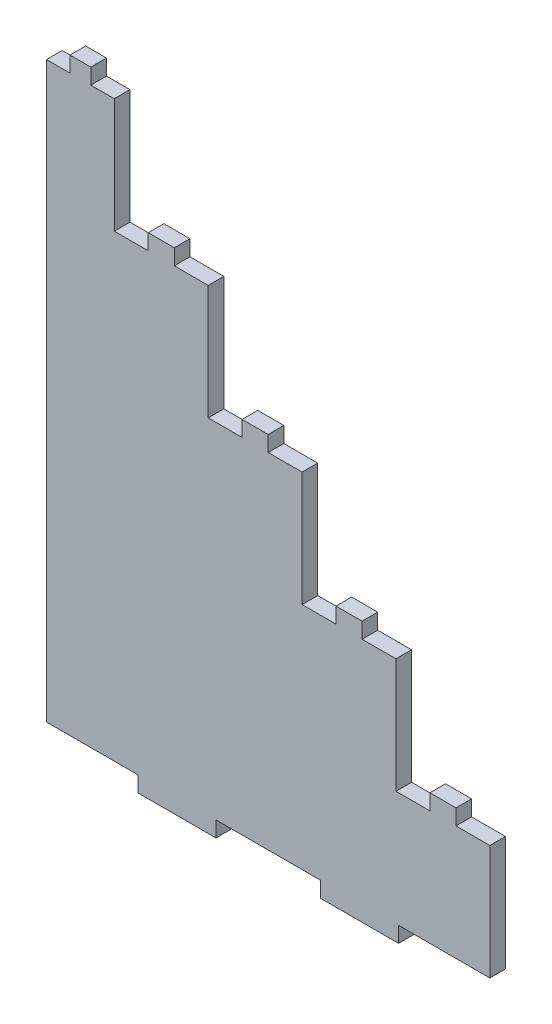
ISO-10303-21;
HEADER;
FILE_DESCRIPTION(('STEP AP214'),'2;1');
FILE_NAME('part.step','',(''),(''),'','','');
FILE_SCHEMA(('AUTOMOTIVE_DESIGN { 1 0 10303 214 1 1 1 1 }'));
ENDSEC;
DATA;
#1=APPLICATION_CONTEXT('core data for automotive mechanical design processes');
#2=APPLICATION_PROTOCOL_DEFINITION('international standard','automotive_design',2000,#1);
#3=PRODUCT_CONTEXT('',#1,'mechanical');
#4=PRODUCT('Part','Part','',(#3));
#5=PRODUCT_RELATED_PRODUCT_CATEGORY('part','',(#4));
#6=PRODUCT_DEFINITION_FORMATION('','',#4);
#7=PRODUCT_DEFINITION_CONTEXT('part definition',#1,'design');
#8=PRODUCT_DEFINITION('design','',#6,#7);
#9=PRODUCT_DEFINITION_SHAPE('','',#8);
#10=(LENGTH_UNIT() NAMED_UNIT(*) SI_UNIT(.MILLI.,.METRE.));
#11=(NAMED_UNIT(*) PLANE_ANGLE_UNIT() SI_UNIT($,.RADIAN.));
#12=(NAMED_UNIT(*) SI_UNIT($,.STERADIAN.) SOLID_ANGLE_UNIT());
#13=UNCERTAINTY_MEASURE_WITH_UNIT(LENGTH_MEASURE(1.E-05),#10,'distance_accuracy_value','');
#14=(GEOMETRIC_REPRESENTATION_CONTEXT(3) GLOBAL_UNCERTAINTY_ASSIGNED_CONTEXT((#13)) GLOBAL_UNIT_ASSIGNED_CONTEXT((#10,
#11,#12)) REPRESENTATION_CONTEXT('',''));
#15=CARTESIAN_POINT('',(0.,0.,0.));
#16=DIRECTION('',(0.,0.,1.));
#17=DIRECTION('',(1.,0.,0.));
#18=AXIS2_PLACEMENT_3D('',#15,#16,#17);
#19=CARTESIAN_POINT('',(134.,44.,6.));
#20=DIRECTION('',(0.,-1.,0.));
#21=DIRECTION('',(0.,0.,-1.));
#22=AXIS2_PLACEMENT_3D('',#19,#20,#21);
#23=PLANE('',#22);
#24=DIRECTION('',(0.,0.,1.));
#25=VECTOR('',#24,1.);
#26=CARTESIAN_POINT('',(147.,44.,6.));
#27=LINE('',#26,#25);
#28=CARTESIAN_POINT('',(147.,44.,0.));
#29=VERTEX_POINT('',#28);
#30=CARTESIAN_POINT('',(147.,44.,6.));
#31=VERTEX_POINT('',#30);
#32=EDGE_CURVE('E316',#29,#31,#27,.T.);
#33=ORIENTED_EDGE('',*,*,#32,.F.);
#34=DIRECTION('',(-1.,0.,0.));
#35=VECTOR('',#34,1.);
#36=CARTESIAN_POINT('',(134.,44.,0.));
#37=LINE('',#36,#35);
#38=CARTESIAN_POINT('',(134.,44.,0.));
#39=VERTEX_POINT('',#38);
#40=EDGE_CURVE('E588',#29,#39,#37,.T.);
#41=ORIENTED_EDGE('',*,*,#40,.T.);
#42=DIRECTION('',(0.,0.,-1.));
#43=VECTOR('',#42,1.);
#44=CARTESIAN_POINT('',(134.,44.,6.));
#45=LINE('',#44,#43);
#46=CARTESIAN_POINT('',(134.,44.,6.));
#47=VERTEX_POINT('',#46);
#48=EDGE_CURVE('E525',#47,#39,#45,.T.);
#49=ORIENTED_EDGE('',*,*,#48,.F.);
#50=DIRECTION('',(-1.,0.,0.));
#51=VECTOR('',#50,1.);
#52=CARTESIAN_POINT('',(134.,44.,6.));
#53=LINE('',#52,#51);
#54=EDGE_CURVE('E50',#31,#47,#53,.T.);
#55=ORIENTED_EDGE('',*,*,#54,.F.);
#56=EDGE_LOOP('',(#33,#41,#49,#55));
#57=FACE_BOUND('',#56,.T.);
#58=ADVANCED_FACE('F33',(#57),#23,.F.);
#59=DIRECTION('',(0.,0.,-1.));
#60=VECTOR('',#59,1.);
#61=CARTESIAN_POINT('',(157.,44.,6.));
#62=LINE('',#61,#60);
#63=CARTESIAN_POINT('',(157.,44.,6.));
#64=VERTEX_POINT('',#63);
#65=CARTESIAN_POINT('',(157.,44.,0.));
#66=VERTEX_POINT('',#65);
#67=EDGE_CURVE('E58',#64,#66,#62,.T.);
#68=ORIENTED_EDGE('',*,*,#67,.F.);
#69=CARTESIAN_POINT('',(170.,44.,6.));
#70=VERTEX_POINT('',#69);
#71=EDGE_CURVE('E597',#70,#64,#53,.T.);
#72=ORIENTED_EDGE('',*,*,#71,.F.);
#73=DIRECTION('',(0.,0.,-1.));
#74=VECTOR('',#73,1.);
#75=CARTESIAN_POINT('',(170.,44.,6.));
#76=LINE('',#75,#74);
#77=CARTESIAN_POINT('',(170.,44.,0.));
#78=VERTEX_POINT('',#77);
#79=EDGE_CURVE('E522',#70,#78,#76,.T.);
#80=ORIENTED_EDGE('',*,*,#79,.T.);
#81=EDGE_CURVE('E587',#78,#66,#37,.T.);
#82=ORIENTED_EDGE('',*,*,#81,.T.);
#83=EDGE_LOOP('',(#68,#72,#80,#82));
#84=FACE_BOUND('',#83,.T.);
#85=ADVANCED_FACE('F596',(#84),#23,.F.);
#86=CARTESIAN_POINT('',(98.,87.9999999999999,6.));
#87=DIRECTION('',(0.,-1.,0.));
#88=DIRECTION('',(1.,0.,0.));
#89=AXIS2_PLACEMENT_3D('',#86,#87,#88);
#90=PLANE('',#89);
#91=DIRECTION('',(0.,0.,1.));
#92=VECTOR('',#91,1.);
#93=CARTESIAN_POINT('',(111.,87.9999999999999,6.));
#94=LINE('',#93,#92);
#95=CARTESIAN_POINT('',(111.,87.9999999999999,0.));
#96=VERTEX_POINT('',#95);
#97=CARTESIAN_POINT('',(111.,87.9999999999999,6.));
#98=VERTEX_POINT('',#97);
#99=EDGE_CURVE('E317',#96,#98,#94,.T.);
#100=ORIENTED_EDGE('',*,*,#99,.F.);
#101=DIRECTION('',(-1.,0.,0.));
#102=VECTOR('',#101,1.);
#103=CARTESIAN_POINT('',(98.,87.9999999999999,0.));
#104=LINE('',#103,#102);
#105=CARTESIAN_POINT('',(98.,87.9999999999999,0.));
#106=VERTEX_POINT('',#105);
#107=EDGE_CURVE('E585',#96,#106,#104,.T.);
#108=ORIENTED_EDGE('',*,*,#107,.T.);
#109=DIRECTION('',(0.,0.,-1.));
#110=VECTOR('',#109,1.);
#111=CARTESIAN_POINT('',(98.,87.9999999999999,6.));
#112=LINE('',#111,#110);
#113=CARTESIAN_POINT('',(98.,87.9999999999999,6.));
#114=VERTEX_POINT('',#113);
#115=EDGE_CURVE('E531',#114,#106,#112,.T.);
#116=ORIENTED_EDGE('',*,*,#115,.F.);
#117=DIRECTION('',(-1.,0.,0.));
#118=VECTOR('',#117,1.);
#119=CARTESIAN_POINT('',(98.,87.9999999999999,6.));
#120=LINE('',#119,#118);
#121=EDGE_CURVE('E682',#98,#114,#120,.T.);
#122=ORIENTED_EDGE('',*,*,#121,.F.);
#123=EDGE_LOOP('',(#100,#108,#116,#122));
#124=FACE_BOUND('',#123,.T.);
#125=ADVANCED_FACE('F624',(#124),#90,.F.);
#126=DIRECTION('',(0.,0.,-1.));
#127=VECTOR('',#126,1.);
#128=CARTESIAN_POINT('',(121.,87.9999999999999,6.));
#129=LINE('',#128,#127);
#130=CARTESIAN_POINT('',(121.,87.9999999999999,6.));
#131=VERTEX_POINT('',#130);
#132=CARTESIAN_POINT('',(121.,87.9999999999999,0.));
#133=VERTEX_POINT('',#132);
#134=EDGE_CURVE('E320',#131,#133,#129,.T.);
#135=ORIENTED_EDGE('',*,*,#134,.F.);
#136=CARTESIAN_POINT('',(134.,87.9999999999999,6.));
#137=VERTEX_POINT('',#136);
#138=EDGE_CURVE('E683',#137,#131,#120,.T.);
#139=ORIENTED_EDGE('',*,*,#138,.F.);
#140=DIRECTION('',(0.,0.,-1.));
#141=VECTOR('',#140,1.);
#142=CARTESIAN_POINT('',(134.,87.9999999999999,6.));
#143=LINE('',#142,#141);
#144=CARTESIAN_POINT('',(134.,87.9999999999999,0.));
#145=VERTEX_POINT('',#144);
#146=EDGE_CURVE('E528',#137,#145,#143,.T.);
#147=ORIENTED_EDGE('',*,*,#146,.T.);
#148=EDGE_CURVE('E583',#145,#133,#104,.T.);
#149=ORIENTED_EDGE('',*,*,#148,.T.);
#150=EDGE_LOOP('',(#135,#139,#147,#149));
#151=FACE_BOUND('',#150,.T.);
#152=ADVANCED_FACE('F806',(#151),#90,.F.);
#153=CARTESIAN_POINT('',(62.,132.,6.));
#154=DIRECTION('',(0.,-1.,0.));
#155=DIRECTION('',(1.,0.,0.));
#156=AXIS2_PLACEMENT_3D('',#153,#154,#155);
#157=PLANE('',#156);
#158=DIRECTION('',(0.,0.,1.));
#159=VECTOR('',#158,1.);
#160=CARTESIAN_POINT('',(75.,132.,6.));
#161=LINE('',#160,#159);
#162=CARTESIAN_POINT('',(75.,132.,0.));
#163=VERTEX_POINT('',#162);
#164=CARTESIAN_POINT('',(75.,132.,6.));
#165=VERTEX_POINT('',#164);
#166=EDGE_CURVE('E349',#163,#165,#161,.T.);
#167=ORIENTED_EDGE('',*,*,#166,.F.);
#168=DIRECTION('',(-1.,0.,0.));
#169=VECTOR('',#168,1.);
#170=CARTESIAN_POINT('',(62.,132.,0.));
#171=LINE('',#170,#169);
#172=CARTESIAN_POINT('',(62.,132.,0.));
#173=VERTEX_POINT('',#172);
#174=EDGE_CURVE('E580',#163,#173,#171,.T.);
#175=ORIENTED_EDGE('',*,*,#174,.T.);
#176=DIRECTION('',(0.,0.,-1.));
#177=VECTOR('',#176,1.);
#178=CARTESIAN_POINT('',(62.,132.,6.));
#179=LINE('',#178,#177);
#180=CARTESIAN_POINT('',(62.,132.,6.));
#181=VERTEX_POINT('',#180);
#182=EDGE_CURVE('E537',#181,#173,#179,.T.);
#183=ORIENTED_EDGE('',*,*,#182,.F.);
#184=DIRECTION('',(-1.,0.,0.));
#185=VECTOR('',#184,1.);
#186=CARTESIAN_POINT('',(62.,132.,6.));
#187=LINE('',#186,#185);
#188=EDGE_CURVE('E688',#165,#181,#187,.T.);
#189=ORIENTED_EDGE('',*,*,#188,.F.);
#190=EDGE_LOOP('',(#167,#175,#183,#189));
#191=FACE_BOUND('',#190,.T.);
#192=ADVANCED_FACE('F767',(#191),#157,.F.);
#193=DIRECTION('',(0.,0.,-1.));
#194=VECTOR('',#193,1.);
#195=CARTESIAN_POINT('',(85.,132.,6.));
#196=LINE('',#195,#194);
#197=CARTESIAN_POINT('',(85.,132.,6.));
#198=VERTEX_POINT('',#197);
#199=CARTESIAN_POINT('',(85.,132.,0.));
#200=VERTEX_POINT('',#199);
#201=EDGE_CURVE('E354',#198,#200,#196,.T.);
#202=ORIENTED_EDGE('',*,*,#201,.F.);
#203=CARTESIAN_POINT('',(98.,132.,6.));
#204=VERTEX_POINT('',#203);
#205=EDGE_CURVE('E689',#204,#198,#187,.T.);
#206=ORIENTED_EDGE('',*,*,#205,.F.);
#207=DIRECTION('',(0.,0.,-1.));
#208=VECTOR('',#207,1.);
#209=CARTESIAN_POINT('',(98.,132.,6.));
#210=LINE('',#209,#208);
#211=CARTESIAN_POINT('',(98.,132.,0.));
#212=VERTEX_POINT('',#211);
#213=EDGE_CURVE('E534',#204,#212,#210,.T.);
#214=ORIENTED_EDGE('',*,*,#213,.T.);
#215=EDGE_CURVE('E578',#212,#200,#171,.T.);
#216=ORIENTED_EDGE('',*,*,#215,.T.);
#217=EDGE_LOOP('',(#202,#206,#214,#216));
#218=FACE_BOUND('',#217,.T.);
#219=ADVANCED_FACE('F782',(#218),#157,.F.);
#220=CARTESIAN_POINT('',(26.,176.,6.));
#221=DIRECTION('',(0.,-1.,0.));
#222=DIRECTION('',(0.,0.,-1.));
#223=AXIS2_PLACEMENT_3D('',#220,#221,#222);
#224=PLANE('',#223);
#225=DIRECTION('',(0.,0.,1.));
#226=VECTOR('',#225,1.);
#227=CARTESIAN_POINT('',(39.,176.,6.));
#228=LINE('',#227,#226);
#229=CARTESIAN_POINT('',(39.,176.,0.));
#230=VERTEX_POINT('',#229);
#231=CARTESIAN_POINT('',(39.,176.,6.));
#232=VERTEX_POINT('',#231);
#233=EDGE_CURVE('E376',#230,#232,#228,.T.);
#234=ORIENTED_EDGE('',*,*,#233,.F.);
#235=DIRECTION('',(-1.,0.,0.));
#236=VECTOR('',#235,1.);
#237=CARTESIAN_POINT('',(26.,176.,0.));
#238=LINE('',#237,#236);
#239=CARTESIAN_POINT('',(26.,176.,0.));
#240=VERTEX_POINT('',#239);
#241=EDGE_CURVE('E572',#230,#240,#238,.T.);
#242=ORIENTED_EDGE('',*,*,#241,.T.);
#243=DIRECTION('',(0.,0.,-1.));
#244=VECTOR('',#243,1.);
#245=CARTESIAN_POINT('',(26.,176.,6.));
#246=LINE('',#245,#244);
#247=CARTESIAN_POINT('',(26.,176.,6.));
#248=VERTEX_POINT('',#247);
#249=EDGE_CURVE('E543',#248,#240,#246,.T.);
#250=ORIENTED_EDGE('',*,*,#249,.F.);
#251=DIRECTION('',(-1.,0.,0.));
#252=VECTOR('',#251,1.);
#253=CARTESIAN_POINT('',(26.,176.,6.));
#254=LINE('',#253,#252);
#255=EDGE_CURVE('E694',#232,#248,#254,.T.);
#256=ORIENTED_EDGE('',*,*,#255,.F.);
#257=EDGE_LOOP('',(#234,#242,#250,#256));
#258=FACE_BOUND('',#257,.T.);
#259=ADVANCED_FACE('F743',(#258),#224,.F.);
#260=DIRECTION('',(0.,0.,-1.));
#261=VECTOR('',#260,1.);
#262=CARTESIAN_POINT('',(49.,176.,6.));
#263=LINE('',#262,#261);
#264=CARTESIAN_POINT('',(49.,176.,6.));
#265=VERTEX_POINT('',#264);
#266=CARTESIAN_POINT('',(49.,176.,0.));
#267=VERTEX_POINT('',#266);
#268=EDGE_CURVE('E381',#265,#267,#263,.T.);
#269=ORIENTED_EDGE('',*,*,#268,.F.);
#270=CARTESIAN_POINT('',(62.,176.,6.));
#271=VERTEX_POINT('',#270);
#272=EDGE_CURVE('E695',#271,#265,#254,.T.);
#273=ORIENTED_EDGE('',*,*,#272,.F.);
#274=DIRECTION('',(0.,0.,-1.));
#275=VECTOR('',#274,1.);
#276=CARTESIAN_POINT('',(62.,176.,6.));
#277=LINE('',#276,#275);
#278=CARTESIAN_POINT('',(62.,176.,0.));
#279=VERTEX_POINT('',#278);
#280=EDGE_CURVE('E540',#271,#279,#277,.T.);
#281=ORIENTED_EDGE('',*,*,#280,.T.);
#282=EDGE_CURVE('E568',#279,#267,#238,.T.);
#283=ORIENTED_EDGE('',*,*,#282,.T.);
#284=EDGE_LOOP('',(#269,#273,#281,#283));
#285=FACE_BOUND('',#284,.T.);
#286=ADVANCED_FACE('F756',(#285),#224,.F.);
#287=CARTESIAN_POINT('',(0.,220.,6.));
#288=DIRECTION('',(0.,-1.,0.));
#289=DIRECTION('',(0.,0.,-1.));
#290=AXIS2_PLACEMENT_3D('',#287,#288,#289);
#291=PLANE('',#290);
#292=DIRECTION('',(0.,0.,1.));
#293=VECTOR('',#292,1.);
#294=CARTESIAN_POINT('',(9.,220.,6.));
#295=LINE('',#294,#293);
#296=CARTESIAN_POINT('',(9.,220.,0.));
#297=VERTEX_POINT('',#296);
#298=CARTESIAN_POINT('',(9.,220.,6.));
#299=VERTEX_POINT('',#298);
#300=EDGE_CURVE('E403',#297,#299,#295,.T.);
#301=ORIENTED_EDGE('',*,*,#300,.F.);
#302=DIRECTION('',(-1.,0.,0.));
#303=VECTOR('',#302,1.);
#304=CARTESIAN_POINT('',(0.,220.,0.));
#305=LINE('',#304,#303);
#306=CARTESIAN_POINT('',(0.,220.,0.));
#307=VERTEX_POINT('',#306);
#308=EDGE_CURVE('E559',#297,#307,#305,.T.);
#309=ORIENTED_EDGE('',*,*,#308,.T.);
#310=DIRECTION('',(0.,0.,-1.));
#311=VECTOR('',#310,1.);
#312=CARTESIAN_POINT('',(0.,220.,6.));
#313=LINE('',#312,#311);
#314=CARTESIAN_POINT('',(0.,220.,6.));
#315=VERTEX_POINT('',#314);
#316=EDGE_CURVE('E549',#315,#307,#313,.T.);
#317=ORIENTED_EDGE('',*,*,#316,.F.);
#318=DIRECTION('',(-1.,0.,0.));
#319=VECTOR('',#318,1.);
#320=CARTESIAN_POINT('',(0.,220.,6.));
#321=LINE('',#320,#319);
#322=EDGE_CURVE('E699',#299,#315,#321,.T.);
#323=ORIENTED_EDGE('',*,*,#322,.F.);
#324=EDGE_LOOP('',(#301,#309,#317,#323));
#325=FACE_BOUND('',#324,.T.);
#326=ADVANCED_FACE('F647',(#325),#291,.F.);
#327=DIRECTION('',(0.,0.,-1.));
#328=VECTOR('',#327,1.);
#329=CARTESIAN_POINT('',(17.,220.,6.));
#330=LINE('',#329,#328);
#331=CARTESIAN_POINT('',(17.,220.,6.));
#332=VERTEX_POINT('',#331);
#333=CARTESIAN_POINT('',(17.,220.,0.));
#334=VERTEX_POINT('',#333);
#335=EDGE_CURVE('E408',#332,#334,#330,.T.);
#336=ORIENTED_EDGE('',*,*,#335,.F.);
#337=CARTESIAN_POINT('',(26.,220.,6.));
#338=VERTEX_POINT('',#337);
#339=EDGE_CURVE('E552',#338,#332,#321,.T.);
#340=ORIENTED_EDGE('',*,*,#339,.F.);
#341=DIRECTION('',(0.,0.,-1.));
#342=VECTOR('',#341,1.);
#343=CARTESIAN_POINT('',(26.,220.,6.));
#344=LINE('',#343,#342);
#345=CARTESIAN_POINT('',(26.,220.,0.));
#346=VERTEX_POINT('',#345);
#347=EDGE_CURVE('E546',#338,#346,#344,.T.);
#348=ORIENTED_EDGE('',*,*,#347,.T.);
#349=EDGE_CURVE('E561',#346,#334,#305,.T.);
#350=ORIENTED_EDGE('',*,*,#349,.T.);
#351=EDGE_LOOP('',(#336,#340,#348,#350));
#352=FACE_BOUND('',#351,.T.);
#353=ADVANCED_FACE('F642',(#352),#291,.F.);
#354=CARTESIAN_POINT('',(0.,0.,6.));
#355=DIRECTION('',(0.,1.,0.));
#356=DIRECTION('',(0.,0.,1.));
#357=AXIS2_PLACEMENT_3D('',#354,#355,#356);
#358=PLANE('',#357);
#359=DIRECTION('',(0.,0.,-1.));
#360=VECTOR('',#359,1.);
#361=CARTESIAN_POINT('',(105.,0.,0.));
#362=LINE('',#361,#360);
#363=CARTESIAN_POINT('',(105.,0.,6.));
#364=VERTEX_POINT('',#363);
#365=CARTESIAN_POINT('',(105.,0.,0.));
#366=VERTEX_POINT('',#365);
#367=EDGE_CURVE('E446',#364,#366,#362,.T.);
#368=ORIENTED_EDGE('',*,*,#367,.F.);
#369=DIRECTION('',(1.,0.,0.));
#370=VECTOR('',#369,1.);
#371=CARTESIAN_POINT('',(0.,0.,6.));
#372=LINE('',#371,#370);
#373=CARTESIAN_POINT('',(65.,0.,6.));
#374=VERTEX_POINT('',#373);
#375=EDGE_CURVE('E650',#374,#364,#372,.T.);
#376=ORIENTED_EDGE('',*,*,#375,.F.);
#377=DIRECTION('',(0.,0.,1.));
#378=VECTOR('',#377,1.);
#379=CARTESIAN_POINT('',(65.,0.,6.));
#380=LINE('',#379,#378);
#381=CARTESIAN_POINT('',(65.,0.,0.));
#382=VERTEX_POINT('',#381);
#383=EDGE_CURVE('E477',#382,#374,#380,.T.);
#384=ORIENTED_EDGE('',*,*,#383,.F.);
#385=DIRECTION('',(1.,0.,0.));
#386=VECTOR('',#385,1.);
#387=CARTESIAN_POINT('',(0.,0.,0.));
#388=LINE('',#387,#386);
#389=EDGE_CURVE('E502',#382,#366,#388,.T.);
#390=ORIENTED_EDGE('',*,*,#389,.T.);
#391=EDGE_LOOP('',(#368,#376,#384,#390));
#392=FACE_BOUND('',#391,.T.);
#393=ADVANCED_FACE('F634',(#392),#358,.F.);
#394=DIRECTION('',(0.,0.,1.));
#395=VECTOR('',#394,1.);
#396=CARTESIAN_POINT('',(135.,0.,0.));
#397=LINE('',#396,#395);
#398=CARTESIAN_POINT('',(135.,0.,0.));
#399=VERTEX_POINT('',#398);
#400=CARTESIAN_POINT('',(135.,0.,6.));
#401=VERTEX_POINT('',#400);
#402=EDGE_CURVE('E449',#399,#401,#397,.T.);
#403=ORIENTED_EDGE('',*,*,#402,.F.);
#404=CARTESIAN_POINT('',(170.,0.,0.));
#405=VERTEX_POINT('',#404);
#406=EDGE_CURVE('E499',#399,#405,#388,.T.);
#407=ORIENTED_EDGE('',*,*,#406,.T.);
#408=DIRECTION('',(0.,0.,-1.));
#409=VECTOR('',#408,1.);
#410=CARTESIAN_POINT('',(170.,0.,6.));
#411=LINE('',#410,#409);
#412=CARTESIAN_POINT('',(170.,0.,6.));
#413=VERTEX_POINT('',#412);
#414=EDGE_CURVE('E42',#413,#405,#411,.T.);
#415=ORIENTED_EDGE('',*,*,#414,.F.);
#416=EDGE_CURVE('E504',#401,#413,#372,.T.);
#417=ORIENTED_EDGE('',*,*,#416,.F.);
#418=EDGE_LOOP('',(#403,#407,#415,#417));
#419=FACE_BOUND('',#418,.T.);
#420=ADVANCED_FACE('F632',(#419),#358,.F.);
#421=DIRECTION('',(0.,0.,-1.));
#422=VECTOR('',#421,1.);
#423=CARTESIAN_POINT('',(35.,0.,6.));
#424=LINE('',#423,#422);
#425=CARTESIAN_POINT('',(35.,0.,6.));
#426=VERTEX_POINT('',#425);
#427=CARTESIAN_POINT('',(35.,0.,0.));
#428=VERTEX_POINT('',#427);
#429=EDGE_CURVE('E472',#426,#428,#424,.T.);
#430=ORIENTED_EDGE('',*,*,#429,.F.);
#431=CARTESIAN_POINT('',(0.,0.,6.));
#432=VERTEX_POINT('',#431);
#433=EDGE_CURVE('E659',#432,#426,#372,.T.);
#434=ORIENTED_EDGE('',*,*,#433,.F.);
#435=DIRECTION('',(0.,0.,-1.));
#436=VECTOR('',#435,1.);
#437=CARTESIAN_POINT('',(0.,0.,6.));
#438=LINE('',#437,#436);
#439=CARTESIAN_POINT('',(0.,0.,0.));
#440=VERTEX_POINT('',#439);
#441=EDGE_CURVE('E11',#432,#440,#438,.T.);
#442=ORIENTED_EDGE('',*,*,#441,.T.);
#443=EDGE_CURVE('E518',#440,#428,#388,.T.);
#444=ORIENTED_EDGE('',*,*,#443,.T.);
#445=EDGE_LOOP('',(#430,#434,#442,#444));
#446=FACE_BOUND('',#445,.T.);
#447=ADVANCED_FACE('F630',(#446),#358,.F.);
#448=CARTESIAN_POINT('',(0.,0.,6.));
#449=DIRECTION('',(1.,0.,0.));
#450=DIRECTION('',(0.,0.,-1.));
#451=AXIS2_PLACEMENT_3D('',#448,#449,#450);
#452=PLANE('',#451);
#453=DIRECTION('',(0.,-1.,0.));
#454=VECTOR('',#453,1.);
#455=CARTESIAN_POINT('',(0.,0.,0.));
#456=LINE('',#455,#454);
#457=EDGE_CURVE('E503',#307,#440,#456,.T.);
#458=ORIENTED_EDGE('',*,*,#457,.T.);
#459=ORIENTED_EDGE('',*,*,#441,.F.);
#460=DIRECTION('',(0.,-1.,0.));
#461=VECTOR('',#460,1.);
#462=CARTESIAN_POINT('',(0.,0.,6.));
#463=LINE('',#462,#461);
#464=EDGE_CURVE('E562',#315,#432,#463,.T.);
#465=ORIENTED_EDGE('',*,*,#464,.F.);
#466=ORIENTED_EDGE('',*,*,#316,.T.);
#467=EDGE_LOOP('',(#458,#459,#465,#466));
#468=FACE_BOUND('',#467,.T.);
#469=ADVANCED_FACE('F35',(#468),#452,.F.);
#470=CARTESIAN_POINT('',(170.,44.,6.));
#471=DIRECTION('',(-1.,0.,0.));
#472=DIRECTION('',(0.,0.,1.));
#473=AXIS2_PLACEMENT_3D('',#470,#471,#472);
#474=PLANE('',#473);
#475=DIRECTION('',(0.,1.,0.));
#476=VECTOR('',#475,1.);
#477=CARTESIAN_POINT('',(170.,44.,0.));
#478=LINE('',#477,#476);
#479=EDGE_CURVE('E511',#405,#78,#478,.T.);
#480=ORIENTED_EDGE('',*,*,#479,.T.);
#481=ORIENTED_EDGE('',*,*,#79,.F.);
#482=DIRECTION('',(0.,1.,0.));
#483=VECTOR('',#482,1.);
#484=CARTESIAN_POINT('',(170.,44.,6.));
#485=LINE('',#484,#483);
#486=EDGE_CURVE('E674',#413,#70,#485,.T.);
#487=ORIENTED_EDGE('',*,*,#486,.F.);
#488=ORIENTED_EDGE('',*,*,#414,.T.);
#489=EDGE_LOOP('',(#480,#481,#487,#488));
#490=FACE_BOUND('',#489,.T.);
#491=ADVANCED_FACE('F593',(#490),#474,.F.);
#492=CARTESIAN_POINT('',(134.,87.9999999999999,6.));
#493=DIRECTION('',(-1.,0.,0.));
#494=DIRECTION('',(0.,0.,1.));
#495=AXIS2_PLACEMENT_3D('',#492,#493,#494);
#496=PLANE('',#495);
#497=DIRECTION('',(0.,1.,0.));
#498=VECTOR('',#497,1.);
#499=CARTESIAN_POINT('',(134.,87.9999999999999,0.));
#500=LINE('',#499,#498);
#501=EDGE_CURVE('E586',#39,#145,#500,.T.);
#502=ORIENTED_EDGE('',*,*,#501,.T.);
#503=ORIENTED_EDGE('',*,*,#146,.F.);
#504=DIRECTION('',(0.,1.,0.));
#505=VECTOR('',#504,1.);
#506=CARTESIAN_POINT('',(134.,87.9999999999999,6.));
#507=LINE('',#506,#505);
#508=EDGE_CURVE('E680',#47,#137,#507,.T.);
#509=ORIENTED_EDGE('',*,*,#508,.F.);
#510=ORIENTED_EDGE('',*,*,#48,.T.);
#511=EDGE_LOOP('',(#502,#503,#509,#510));
#512=FACE_BOUND('',#511,.T.);
#513=ADVANCED_FACE('F627',(#512),#496,.F.);
#514=CARTESIAN_POINT('',(98.,132.,6.));
#515=DIRECTION('',(-1.,0.,0.));
#516=DIRECTION('',(0.,0.,1.));
#517=AXIS2_PLACEMENT_3D('',#514,#515,#516);
#518=PLANE('',#517);
#519=DIRECTION('',(0.,1.,0.));
#520=VECTOR('',#519,1.);
#521=CARTESIAN_POINT('',(98.,132.,0.));
#522=LINE('',#521,#520);
#523=EDGE_CURVE('E581',#106,#212,#522,.T.);
#524=ORIENTED_EDGE('',*,*,#523,.T.);
#525=ORIENTED_EDGE('',*,*,#213,.F.);
#526=DIRECTION('',(0.,1.,0.));
#527=VECTOR('',#526,1.);
#528=CARTESIAN_POINT('',(98.,132.,6.));
#529=LINE('',#528,#527);
#530=EDGE_CURVE('E686',#114,#204,#529,.T.);
#531=ORIENTED_EDGE('',*,*,#530,.F.);
#532=ORIENTED_EDGE('',*,*,#115,.T.);
#533=EDGE_LOOP('',(#524,#525,#531,#532));
#534=FACE_BOUND('',#533,.T.);
#535=ADVANCED_FACE('F787',(#534),#518,.F.);
#536=CARTESIAN_POINT('',(62.,176.,6.));
#537=DIRECTION('',(-1.,0.,0.));
#538=DIRECTION('',(0.,0.,1.));
#539=AXIS2_PLACEMENT_3D('',#536,#537,#538);
#540=PLANE('',#539);
#541=DIRECTION('',(0.,1.,0.));
#542=VECTOR('',#541,1.);
#543=CARTESIAN_POINT('',(62.,176.,0.));
#544=LINE('',#543,#542);
#545=EDGE_CURVE('E575',#173,#279,#544,.T.);
#546=ORIENTED_EDGE('',*,*,#545,.T.);
#547=ORIENTED_EDGE('',*,*,#280,.F.);
#548=DIRECTION('',(0.,1.,0.));
#549=VECTOR('',#548,1.);
#550=CARTESIAN_POINT('',(62.,176.,6.));
#551=LINE('',#550,#549);
#552=EDGE_CURVE('E692',#181,#271,#551,.T.);
#553=ORIENTED_EDGE('',*,*,#552,.F.);
#554=ORIENTED_EDGE('',*,*,#182,.T.);
#555=EDGE_LOOP('',(#546,#547,#553,#554));
#556=FACE_BOUND('',#555,.T.);
#557=ADVANCED_FACE('F761',(#556),#540,.F.);
#558=CARTESIAN_POINT('',(26.,220.,6.));
#559=DIRECTION('',(-1.,0.,0.));
#560=DIRECTION('',(0.,-1.,0.));
#561=AXIS2_PLACEMENT_3D('',#558,#559,#560);
#562=PLANE('',#561);
#563=DIRECTION('',(0.,1.,0.));
#564=VECTOR('',#563,1.);
#565=CARTESIAN_POINT('',(26.,220.,0.));
#566=LINE('',#565,#564);
#567=EDGE_CURVE('E555',#240,#346,#566,.T.);
#568=ORIENTED_EDGE('',*,*,#567,.T.);
#569=ORIENTED_EDGE('',*,*,#347,.F.);
#570=DIRECTION('',(0.,1.,0.));
#571=VECTOR('',#570,1.);
#572=CARTESIAN_POINT('',(26.,220.,6.));
#573=LINE('',#572,#571);
#574=EDGE_CURVE('E698',#248,#338,#573,.T.);
#575=ORIENTED_EDGE('',*,*,#574,.F.);
#576=ORIENTED_EDGE('',*,*,#249,.T.);
#577=EDGE_LOOP('',(#568,#569,#575,#576));
#578=FACE_BOUND('',#577,.T.);
#579=ADVANCED_FACE('F818',(#578),#562,.F.);
#580=CARTESIAN_POINT('',(0.,0.,6.));
#581=DIRECTION('',(0.,0.,-1.));
#582=DIRECTION('',(-1.,0.,0.));
#583=AXIS2_PLACEMENT_3D('',#580,#581,#582);
#584=PLANE('',#583);
#585=ORIENTED_EDGE('',*,*,#464,.T.);
#586=ORIENTED_EDGE('',*,*,#433,.T.);
#587=DIRECTION('',(0.,1.,0.));
#588=VECTOR('',#587,1.);
#589=CARTESIAN_POINT('',(35.,-6.,6.));
#590=LINE('',#589,#588);
#591=CARTESIAN_POINT('',(35.,-6.,6.));
#592=VERTEX_POINT('',#591);
#593=EDGE_CURVE('E483',#592,#426,#590,.T.);
#594=ORIENTED_EDGE('',*,*,#593,.F.);
#595=DIRECTION('',(-1.,0.,0.));
#596=VECTOR('',#595,1.);
#597=CARTESIAN_POINT('',(35.,-6.,6.));
#598=LINE('',#597,#596);
#599=CARTESIAN_POINT('',(65.,-6.,6.));
#600=VERTEX_POINT('',#599);
#601=EDGE_CURVE('E481',#600,#592,#598,.T.);
#602=ORIENTED_EDGE('',*,*,#601,.F.);
#603=DIRECTION('',(0.,1.,0.));
#604=VECTOR('',#603,1.);
#605=CARTESIAN_POINT('',(65.,-6.,6.));
#606=LINE('',#605,#604);
#607=EDGE_CURVE('E496',#600,#374,#606,.T.);
#608=ORIENTED_EDGE('',*,*,#607,.T.);
#609=ORIENTED_EDGE('',*,*,#375,.T.);
#610=DIRECTION('',(0.,1.,0.));
#611=VECTOR('',#610,1.);
#612=CARTESIAN_POINT('',(105.,-6.,6.00000000000001));
#613=LINE('',#612,#611);
#614=CARTESIAN_POINT('',(105.,-6.,6.00000000000001));
#615=VERTEX_POINT('',#614);
#616=EDGE_CURVE('E461',#615,#364,#613,.T.);
#617=ORIENTED_EDGE('',*,*,#616,.F.);
#618=DIRECTION('',(-1.,0.,0.));
#619=VECTOR('',#618,1.);
#620=CARTESIAN_POINT('',(105.,-6.,6.00000000000001));
#621=LINE('',#620,#619);
#622=CARTESIAN_POINT('',(135.,-6.,6.00000000000002));
#623=VERTEX_POINT('',#622);
#624=EDGE_CURVE('E458',#623,#615,#621,.T.);
#625=ORIENTED_EDGE('',*,*,#624,.F.);
#626=DIRECTION('',(0.,1.,0.));
#627=VECTOR('',#626,1.);
#628=CARTESIAN_POINT('',(135.,-6.,6.00000000000002));
#629=LINE('',#628,#627);
#630=EDGE_CURVE('E463',#623,#401,#629,.T.);
#631=ORIENTED_EDGE('',*,*,#630,.T.);
#632=ORIENTED_EDGE('',*,*,#416,.T.);
#633=ORIENTED_EDGE('',*,*,#486,.T.);
#634=ORIENTED_EDGE('',*,*,#71,.T.);
#635=DIRECTION('',(0.,-1.,0.));
#636=VECTOR('',#635,1.);
#637=CARTESIAN_POINT('',(157.,50.,6.));
#638=LINE('',#637,#636);
#639=CARTESIAN_POINT('',(157.,50.,6.));
#640=VERTEX_POINT('',#639);
#641=EDGE_CURVE('E301',#640,#64,#638,.T.);
#642=ORIENTED_EDGE('',*,*,#641,.F.);
#643=DIRECTION('',(1.,0.,0.));
#644=VECTOR('',#643,1.);
#645=CARTESIAN_POINT('',(147.,50.,6.));
#646=LINE('',#645,#644);
#647=CARTESIAN_POINT('',(147.,50.,6.));
#648=VERTEX_POINT('',#647);
#649=EDGE_CURVE('E293',#648,#640,#646,.T.);
#650=ORIENTED_EDGE('',*,*,#649,.F.);
#651=DIRECTION('',(0.,-1.,0.));
#652=VECTOR('',#651,1.);
#653=CARTESIAN_POINT('',(147.,50.,6.));
#654=LINE('',#653,#652);
#655=EDGE_CURVE('E298',#648,#31,#654,.T.);
#656=ORIENTED_EDGE('',*,*,#655,.T.);
#657=ORIENTED_EDGE('',*,*,#54,.T.);
#658=ORIENTED_EDGE('',*,*,#508,.T.);
#659=ORIENTED_EDGE('',*,*,#138,.T.);
#660=DIRECTION('',(0.,-1.,0.));
#661=VECTOR('',#660,1.);
#662=CARTESIAN_POINT('',(121.,93.9999999999999,6.));
#663=LINE('',#662,#661);
#664=CARTESIAN_POINT('',(121.,93.9999999999999,6.));
#665=VERTEX_POINT('',#664);
#666=EDGE_CURVE('E343',#665,#131,#663,.T.);
#667=ORIENTED_EDGE('',*,*,#666,.F.);
#668=DIRECTION('',(1.,0.,0.));
#669=VECTOR('',#668,1.);
#670=CARTESIAN_POINT('',(111.,93.9999999999999,6.));
#671=LINE('',#670,#669);
#672=CARTESIAN_POINT('',(111.,93.9999999999999,6.));
#673=VERTEX_POINT('',#672);
#674=EDGE_CURVE('E329',#673,#665,#671,.T.);
#675=ORIENTED_EDGE('',*,*,#674,.F.);
#676=DIRECTION('',(0.,-1.,0.));
#677=VECTOR('',#676,1.);
#678=CARTESIAN_POINT('',(111.,93.9999999999999,6.));
#679=LINE('',#678,#677);
#680=EDGE_CURVE('E346',#673,#98,#679,.T.);
#681=ORIENTED_EDGE('',*,*,#680,.T.);
#682=ORIENTED_EDGE('',*,*,#121,.T.);
#683=ORIENTED_EDGE('',*,*,#530,.T.);
#684=ORIENTED_EDGE('',*,*,#205,.T.);
#685=DIRECTION('',(0.,-1.,0.));
#686=VECTOR('',#685,1.);
#687=CARTESIAN_POINT('',(85.,138.,6.));
#688=LINE('',#687,#686);
#689=CARTESIAN_POINT('',(85.,138.,6.));
#690=VERTEX_POINT('',#689);
#691=EDGE_CURVE('E370',#690,#198,#688,.T.);
#692=ORIENTED_EDGE('',*,*,#691,.F.);
#693=DIRECTION('',(1.,0.,0.));
#694=VECTOR('',#693,1.);
#695=CARTESIAN_POINT('',(75.,138.,6.));
#696=LINE('',#695,#694);
#697=CARTESIAN_POINT('',(75.,138.,6.));
#698=VERTEX_POINT('',#697);
#699=EDGE_CURVE('E353',#698,#690,#696,.T.);
#700=ORIENTED_EDGE('',*,*,#699,.F.);
#701=DIRECTION('',(0.,-1.,0.));
#702=VECTOR('',#701,1.);
#703=CARTESIAN_POINT('',(75.,138.,6.));
#704=LINE('',#703,#702);
#705=EDGE_CURVE('E373',#698,#165,#704,.T.);
#706=ORIENTED_EDGE('',*,*,#705,.T.);
#707=ORIENTED_EDGE('',*,*,#188,.T.);
#708=ORIENTED_EDGE('',*,*,#552,.T.);
#709=ORIENTED_EDGE('',*,*,#272,.T.);
#710=DIRECTION('',(0.,-1.,0.));
#711=VECTOR('',#710,1.);
#712=CARTESIAN_POINT('',(49.,182.,6.));
#713=LINE('',#712,#711);
#714=CARTESIAN_POINT('',(49.,182.,6.));
#715=VERTEX_POINT('',#714);
#716=EDGE_CURVE('E397',#715,#265,#713,.T.);
#717=ORIENTED_EDGE('',*,*,#716,.F.);
#718=DIRECTION('',(1.,0.,0.));
#719=VECTOR('',#718,1.);
#720=CARTESIAN_POINT('',(39.,182.,6.));
#721=LINE('',#720,#719);
#722=CARTESIAN_POINT('',(39.,182.,6.));
#723=VERTEX_POINT('',#722);
#724=EDGE_CURVE('E380',#723,#715,#721,.T.);
#725=ORIENTED_EDGE('',*,*,#724,.F.);
#726=DIRECTION('',(0.,-1.,0.));
#727=VECTOR('',#726,1.);
#728=CARTESIAN_POINT('',(39.,182.,6.));
#729=LINE('',#728,#727);
#730=EDGE_CURVE('E400',#723,#232,#729,.T.);
#731=ORIENTED_EDGE('',*,*,#730,.T.);
#732=ORIENTED_EDGE('',*,*,#255,.T.);
#733=ORIENTED_EDGE('',*,*,#574,.T.);
#734=ORIENTED_EDGE('',*,*,#339,.T.);
#735=DIRECTION('',(0.,-1.,0.));
#736=VECTOR('',#735,1.);
#737=CARTESIAN_POINT('',(17.,226.,6.));
#738=LINE('',#737,#736);
#739=CARTESIAN_POINT('',(17.,226.,6.));
#740=VERTEX_POINT('',#739);
#741=EDGE_CURVE('E430',#740,#332,#738,.T.);
#742=ORIENTED_EDGE('',*,*,#741,.F.);
#743=DIRECTION('',(1.,0.,0.));
#744=VECTOR('',#743,1.);
#745=CARTESIAN_POINT('',(9.,226.,6.));
#746=LINE('',#745,#744);
#747=CARTESIAN_POINT('',(9.,226.,6.));
#748=VERTEX_POINT('',#747);
#749=EDGE_CURVE('E407',#748,#740,#746,.T.);
#750=ORIENTED_EDGE('',*,*,#749,.F.);
#751=DIRECTION('',(0.,-1.,0.));
#752=VECTOR('',#751,1.);
#753=CARTESIAN_POINT('',(9.,226.,6.));
#754=LINE('',#753,#752);
#755=EDGE_CURVE('E437',#748,#299,#754,.T.);
#756=ORIENTED_EDGE('',*,*,#755,.T.);
#757=ORIENTED_EDGE('',*,*,#322,.T.);
#758=EDGE_LOOP('',(#585,#586,#594,#602,#608,#609,#617,#625,#631,#632,#633,#634,#642,#650,#656,
#657,#658,#659,#667,#675,#681,#682,#683,#684,#692,#700,#706,#707,#708,#709,#717,#725,#731,#732,
#733,#734,#742,#750,#756,#757));
#759=FACE_BOUND('',#758,.T.);
#760=ADVANCED_FACE('F296',(#759),#584,.F.);
#761=CARTESIAN_POINT('',(0.,0.,0.));
#762=DIRECTION('',(0.,0.,-1.));
#763=DIRECTION('',(-1.,0.,0.));
#764=AXIS2_PLACEMENT_3D('',#761,#762,#763);
#765=PLANE('',#764);
#766=ORIENTED_EDGE('',*,*,#457,.F.);
#767=ORIENTED_EDGE('',*,*,#308,.F.);
#768=DIRECTION('',(0.,-1.,0.));
#769=VECTOR('',#768,1.);
#770=CARTESIAN_POINT('',(9.,226.,0.));
#771=LINE('',#770,#769);
#772=CARTESIAN_POINT('',(9.,226.,0.));
#773=VERTEX_POINT('',#772);
#774=EDGE_CURVE('E414',#773,#297,#771,.T.);
#775=ORIENTED_EDGE('',*,*,#774,.F.);
#776=DIRECTION('',(-1.,0.,0.));
#777=VECTOR('',#776,1.);
#778=CARTESIAN_POINT('',(9.,226.,0.));
#779=LINE('',#778,#777);
#780=CARTESIAN_POINT('',(17.,226.,0.));
#781=VERTEX_POINT('',#780);
#782=EDGE_CURVE('E412',#781,#773,#779,.T.);
#783=ORIENTED_EDGE('',*,*,#782,.F.);
#784=DIRECTION('',(0.,-1.,0.));
#785=VECTOR('',#784,1.);
#786=CARTESIAN_POINT('',(17.,226.,0.));
#787=LINE('',#786,#785);
#788=EDGE_CURVE('E425',#781,#334,#787,.T.);
#789=ORIENTED_EDGE('',*,*,#788,.T.);
#790=ORIENTED_EDGE('',*,*,#349,.F.);
#791=ORIENTED_EDGE('',*,*,#567,.F.);
#792=ORIENTED_EDGE('',*,*,#241,.F.);
#793=DIRECTION('',(0.,-1.,0.));
#794=VECTOR('',#793,1.);
#795=CARTESIAN_POINT('',(39.,182.,0.));
#796=LINE('',#795,#794);
#797=CARTESIAN_POINT('',(39.,182.,0.));
#798=VERTEX_POINT('',#797);
#799=EDGE_CURVE('E387',#798,#230,#796,.T.);
#800=ORIENTED_EDGE('',*,*,#799,.F.);
#801=DIRECTION('',(-1.,0.,0.));
#802=VECTOR('',#801,1.);
#803=CARTESIAN_POINT('',(39.,182.,0.));
#804=LINE('',#803,#802);
#805=CARTESIAN_POINT('',(49.,182.,0.));
#806=VERTEX_POINT('',#805);
#807=EDGE_CURVE('E385',#806,#798,#804,.T.);
#808=ORIENTED_EDGE('',*,*,#807,.F.);
#809=DIRECTION('',(0.,-1.,0.));
#810=VECTOR('',#809,1.);
#811=CARTESIAN_POINT('',(49.,182.,0.));
#812=LINE('',#811,#810);
#813=EDGE_CURVE('E394',#806,#267,#812,.T.);
#814=ORIENTED_EDGE('',*,*,#813,.T.);
#815=ORIENTED_EDGE('',*,*,#282,.F.);
#816=ORIENTED_EDGE('',*,*,#545,.F.);
#817=ORIENTED_EDGE('',*,*,#174,.F.);
#818=DIRECTION('',(0.,-1.,0.));
#819=VECTOR('',#818,1.);
#820=CARTESIAN_POINT('',(75.,138.,0.));
#821=LINE('',#820,#819);
#822=CARTESIAN_POINT('',(75.,138.,0.));
#823=VERTEX_POINT('',#822);
#824=EDGE_CURVE('E360',#823,#163,#821,.T.);
#825=ORIENTED_EDGE('',*,*,#824,.F.);
#826=DIRECTION('',(-1.,0.,0.));
#827=VECTOR('',#826,1.);
#828=CARTESIAN_POINT('',(75.,138.,0.));
#829=LINE('',#828,#827);
#830=CARTESIAN_POINT('',(85.,138.,0.));
#831=VERTEX_POINT('',#830);
#832=EDGE_CURVE('E358',#831,#823,#829,.T.);
#833=ORIENTED_EDGE('',*,*,#832,.F.);
#834=DIRECTION('',(0.,-1.,0.));
#835=VECTOR('',#834,1.);
#836=CARTESIAN_POINT('',(85.,138.,0.));
#837=LINE('',#836,#835);
#838=EDGE_CURVE('E367',#831,#200,#837,.T.);
#839=ORIENTED_EDGE('',*,*,#838,.T.);
#840=ORIENTED_EDGE('',*,*,#215,.F.);
#841=ORIENTED_EDGE('',*,*,#523,.F.);
#842=ORIENTED_EDGE('',*,*,#107,.F.);
#843=DIRECTION('',(0.,-1.,0.));
#844=VECTOR('',#843,1.);
#845=CARTESIAN_POINT('',(111.,93.9999999999999,0.));
#846=LINE('',#845,#844);
#847=CARTESIAN_POINT('',(111.,93.9999999999999,0.));
#848=VERTEX_POINT('',#847);
#849=EDGE_CURVE('E334',#848,#96,#846,.T.);
#850=ORIENTED_EDGE('',*,*,#849,.F.);
#851=DIRECTION('',(-1.,0.,0.));
#852=VECTOR('',#851,1.);
#853=CARTESIAN_POINT('',(111.,93.9999999999999,0.));
#854=LINE('',#853,#852);
#855=CARTESIAN_POINT('',(121.,93.9999999999999,0.));
#856=VERTEX_POINT('',#855);
#857=EDGE_CURVE('E333',#856,#848,#854,.T.);
#858=ORIENTED_EDGE('',*,*,#857,.F.);
#859=DIRECTION('',(0.,-1.,0.));
#860=VECTOR('',#859,1.);
#861=CARTESIAN_POINT('',(121.,93.9999999999999,0.));
#862=LINE('',#861,#860);
#863=EDGE_CURVE('E340',#856,#133,#862,.T.);
#864=ORIENTED_EDGE('',*,*,#863,.T.);
#865=ORIENTED_EDGE('',*,*,#148,.F.);
#866=ORIENTED_EDGE('',*,*,#501,.F.);
#867=ORIENTED_EDGE('',*,*,#40,.F.);
#868=DIRECTION('',(0.,-1.,0.));
#869=VECTOR('',#868,1.);
#870=CARTESIAN_POINT('',(147.,50.,0.));
#871=LINE('',#870,#869);
#872=CARTESIAN_POINT('',(147.,50.,0.));
#873=VERTEX_POINT('',#872);
#874=EDGE_CURVE('E603',#873,#29,#871,.T.);
#875=ORIENTED_EDGE('',*,*,#874,.F.);
#876=DIRECTION('',(-1.,0.,0.));
#877=VECTOR('',#876,1.);
#878=CARTESIAN_POINT('',(147.,50.,0.));
#879=LINE('',#878,#877);
#880=CARTESIAN_POINT('',(157.,50.,0.));
#881=VERTEX_POINT('',#880);
#882=EDGE_CURVE('E310',#881,#873,#879,.T.);
#883=ORIENTED_EDGE('',*,*,#882,.F.);
#884=DIRECTION('',(0.,-1.,0.));
#885=VECTOR('',#884,1.);
#886=CARTESIAN_POINT('',(157.,50.,0.));
#887=LINE('',#886,#885);
#888=EDGE_CURVE('E322',#881,#66,#887,.T.);
#889=ORIENTED_EDGE('',*,*,#888,.T.);
#890=ORIENTED_EDGE('',*,*,#81,.F.);
#891=ORIENTED_EDGE('',*,*,#479,.F.);
#892=ORIENTED_EDGE('',*,*,#406,.F.);
#893=DIRECTION('',(0.,1.,0.));
#894=VECTOR('',#893,1.);
#895=CARTESIAN_POINT('',(135.,-6.,0.));
#896=LINE('',#895,#894);
#897=CARTESIAN_POINT('',(135.,-6.,0.));
#898=VERTEX_POINT('',#897);
#899=EDGE_CURVE('E466',#898,#399,#896,.T.);
#900=ORIENTED_EDGE('',*,*,#899,.F.);
#901=DIRECTION('',(1.,0.,0.));
#902=VECTOR('',#901,1.);
#903=CARTESIAN_POINT('',(105.,-6.,0.));
#904=LINE('',#903,#902);
#905=CARTESIAN_POINT('',(105.,-6.,0.));
#906=VERTEX_POINT('',#905);
#907=EDGE_CURVE('E664',#906,#898,#904,.T.);
#908=ORIENTED_EDGE('',*,*,#907,.F.);
#909=DIRECTION('',(0.,1.,0.));
#910=VECTOR('',#909,1.);
#911=CARTESIAN_POINT('',(105.,-6.,0.));
#912=LINE('',#911,#910);
#913=EDGE_CURVE('E469',#906,#366,#912,.T.);
#914=ORIENTED_EDGE('',*,*,#913,.T.);
#915=ORIENTED_EDGE('',*,*,#389,.F.);
#916=DIRECTION('',(0.,1.,0.));
#917=VECTOR('',#916,1.);
#918=CARTESIAN_POINT('',(65.,-6.,0.));
#919=LINE('',#918,#917);
#920=CARTESIAN_POINT('',(65.,-6.,0.));
#921=VERTEX_POINT('',#920);
#922=EDGE_CURVE('E722',#921,#382,#919,.T.);
#923=ORIENTED_EDGE('',*,*,#922,.F.);
#924=DIRECTION('',(1.,0.,0.));
#925=VECTOR('',#924,1.);
#926=CARTESIAN_POINT('',(35.,-6.,0.));
#927=LINE('',#926,#925);
#928=CARTESIAN_POINT('',(35.,-6.,0.));
#929=VERTEX_POINT('',#928);
#930=EDGE_CURVE('E476',#929,#921,#927,.T.);
#931=ORIENTED_EDGE('',*,*,#930,.F.);
#932=DIRECTION('',(0.,1.,0.));
#933=VECTOR('',#932,1.);
#934=CARTESIAN_POINT('',(35.,-6.,0.));
#935=LINE('',#934,#933);
#936=EDGE_CURVE('E714',#929,#428,#935,.T.);
#937=ORIENTED_EDGE('',*,*,#936,.T.);
#938=ORIENTED_EDGE('',*,*,#443,.F.);
#939=EDGE_LOOP('',(#766,#767,#775,#783,#789,#790,#791,#792,#800,#808,#814,#815,#816,#817,#825,
#833,#839,#840,#841,#842,#850,#858,#864,#865,#866,#867,#875,#883,#889,#890,#891,#892,#900,#908,
#914,#915,#923,#931,#937,#938));
#940=FACE_BOUND('',#939,.T.);
#941=ADVANCED_FACE('F600',(#940),#765,.T.);
#942=CARTESIAN_POINT('',(35.,-6.,6.));
#943=DIRECTION('',(1.,0.,0.));
#944=DIRECTION('',(0.,0.,-1.));
#945=AXIS2_PLACEMENT_3D('',#942,#943,#944);
#946=PLANE('',#945);
#947=ORIENTED_EDGE('',*,*,#429,.T.);
#948=ORIENTED_EDGE('',*,*,#936,.F.);
#949=DIRECTION('',(0.,0.,-1.));
#950=VECTOR('',#949,1.);
#951=CARTESIAN_POINT('',(35.,-6.,6.));
#952=LINE('',#951,#950);
#953=EDGE_CURVE('E473',#592,#929,#952,.T.);
#954=ORIENTED_EDGE('',*,*,#953,.F.);
#955=ORIENTED_EDGE('',*,*,#593,.T.);
#956=EDGE_LOOP('',(#947,#948,#954,#955));
#957=FACE_BOUND('',#956,.T.);
#958=ADVANCED_FACE('F712',(#957),#946,.F.);
#959=CARTESIAN_POINT('',(65.,-6.,6.));
#960=DIRECTION('',(-1.,0.,0.));
#961=DIRECTION('',(0.,0.,1.));
#962=AXIS2_PLACEMENT_3D('',#959,#960,#961);
#963=PLANE('',#962);
#964=ORIENTED_EDGE('',*,*,#383,.T.);
#965=ORIENTED_EDGE('',*,*,#607,.F.);
#966=DIRECTION('',(0.,0.,1.));
#967=VECTOR('',#966,1.);
#968=CARTESIAN_POINT('',(65.,-6.,6.));
#969=LINE('',#968,#967);
#970=EDGE_CURVE('E479',#921,#600,#969,.T.);
#971=ORIENTED_EDGE('',*,*,#970,.F.);
#972=ORIENTED_EDGE('',*,*,#922,.T.);
#973=EDGE_LOOP('',(#964,#965,#971,#972));
#974=FACE_BOUND('',#973,.T.);
#975=ADVANCED_FACE('F721',(#974),#963,.F.);
#976=CARTESIAN_POINT('',(0.,-6.,0.));
#977=DIRECTION('',(0.,-1.,0.));
#978=DIRECTION('',(0.,0.,-1.));
#979=AXIS2_PLACEMENT_3D('',#976,#977,#978);
#980=PLANE('',#979);
#981=ORIENTED_EDGE('',*,*,#953,.T.);
#982=ORIENTED_EDGE('',*,*,#930,.T.);
#983=ORIENTED_EDGE('',*,*,#970,.T.);
#984=ORIENTED_EDGE('',*,*,#601,.T.);
#985=EDGE_LOOP('',(#981,#982,#983,#984));
#986=FACE_BOUND('',#985,.T.);
#987=ADVANCED_FACE('F716',(#986),#980,.T.);
#988=CARTESIAN_POINT('',(105.,-6.,0.));
#989=DIRECTION('',(1.,0.,0.));
#990=DIRECTION('',(0.,0.,-1.));
#991=AXIS2_PLACEMENT_3D('',#988,#989,#990);
#992=PLANE('',#991);
#993=ORIENTED_EDGE('',*,*,#367,.T.);
#994=ORIENTED_EDGE('',*,*,#913,.F.);
#995=DIRECTION('',(0.,0.,-1.));
#996=VECTOR('',#995,1.);
#997=CARTESIAN_POINT('',(105.,-6.,0.));
#998=LINE('',#997,#996);
#999=EDGE_CURVE('E455',#615,#906,#998,.T.);
#1000=ORIENTED_EDGE('',*,*,#999,.F.);
#1001=ORIENTED_EDGE('',*,*,#616,.T.);
#1002=EDGE_LOOP('',(#993,#994,#1000,#1001));
#1003=FACE_BOUND('',#1002,.T.);
#1004=ADVANCED_FACE('F661',(#1003),#992,.F.);
#1005=CARTESIAN_POINT('',(135.,-6.,0.));
#1006=DIRECTION('',(-1.,0.,0.));
#1007=DIRECTION('',(0.,0.,1.));
#1008=AXIS2_PLACEMENT_3D('',#1005,#1006,#1007);
#1009=PLANE('',#1008);
#1010=ORIENTED_EDGE('',*,*,#402,.T.);
#1011=ORIENTED_EDGE('',*,*,#630,.F.);
#1012=DIRECTION('',(0.,0.,1.));
#1013=VECTOR('',#1012,1.);
#1014=CARTESIAN_POINT('',(135.,-6.,0.));
#1015=LINE('',#1014,#1013);
#1016=EDGE_CURVE('E665',#898,#623,#1015,.T.);
#1017=ORIENTED_EDGE('',*,*,#1016,.F.);
#1018=ORIENTED_EDGE('',*,*,#899,.T.);
#1019=EDGE_LOOP('',(#1010,#1011,#1017,#1018));
#1020=FACE_BOUND('',#1019,.T.);
#1021=ADVANCED_FACE('F671',(#1020),#1009,.F.);
#1022=CARTESIAN_POINT('',(0.,-6.,0.));
#1023=DIRECTION('',(0.,1.,0.));
#1024=DIRECTION('',(0.,0.,1.));
#1025=AXIS2_PLACEMENT_3D('',#1022,#1023,#1024);
#1026=PLANE('',#1025);
#1027=ORIENTED_EDGE('',*,*,#999,.T.);
#1028=ORIENTED_EDGE('',*,*,#907,.T.);
#1029=ORIENTED_EDGE('',*,*,#1016,.T.);
#1030=ORIENTED_EDGE('',*,*,#624,.T.);
#1031=EDGE_LOOP('',(#1027,#1028,#1029,#1030));
#1032=FACE_BOUND('',#1031,.T.);
#1033=ADVANCED_FACE('F669',(#1032),#1026,.F.);
#1034=CARTESIAN_POINT('',(9.,226.,6.));
#1035=DIRECTION('',(1.,0.,0.));
#1036=DIRECTION('',(0.,0.,-1.));
#1037=AXIS2_PLACEMENT_3D('',#1034,#1035,#1036);
#1038=PLANE('',#1037);
#1039=ORIENTED_EDGE('',*,*,#300,.T.);
#1040=ORIENTED_EDGE('',*,*,#755,.F.);
#1041=DIRECTION('',(0.,0.,1.));
#1042=VECTOR('',#1041,1.);
#1043=CARTESIAN_POINT('',(9.,226.,6.));
#1044=LINE('',#1043,#1042);
#1045=EDGE_CURVE('E404',#773,#748,#1044,.T.);
#1046=ORIENTED_EDGE('',*,*,#1045,.F.);
#1047=ORIENTED_EDGE('',*,*,#774,.T.);
#1048=EDGE_LOOP('',(#1039,#1040,#1046,#1047));
#1049=FACE_BOUND('',#1048,.T.);
#1050=ADVANCED_FACE('F730',(#1049),#1038,.F.);
#1051=CARTESIAN_POINT('',(17.,226.,6.));
#1052=DIRECTION('',(-1.,0.,0.));
#1053=DIRECTION('',(0.,0.,1.));
#1054=AXIS2_PLACEMENT_3D('',#1051,#1052,#1053);
#1055=PLANE('',#1054);
#1056=ORIENTED_EDGE('',*,*,#335,.T.);
#1057=ORIENTED_EDGE('',*,*,#788,.F.);
#1058=DIRECTION('',(0.,0.,-1.));
#1059=VECTOR('',#1058,1.);
#1060=CARTESIAN_POINT('',(17.,226.,6.));
#1061=LINE('',#1060,#1059);
#1062=EDGE_CURVE('E410',#740,#781,#1061,.T.);
#1063=ORIENTED_EDGE('',*,*,#1062,.F.);
#1064=ORIENTED_EDGE('',*,*,#741,.T.);
#1065=EDGE_LOOP('',(#1056,#1057,#1063,#1064));
#1066=FACE_BOUND('',#1065,.T.);
#1067=ADVANCED_FACE('F735',(#1066),#1055,.F.);
#1068=CARTESIAN_POINT('',(0.,226.,0.));
#1069=DIRECTION('',(0.,-1.,0.));
#1070=DIRECTION('',(0.,0.,-1.));
#1071=AXIS2_PLACEMENT_3D('',#1068,#1069,#1070);
#1072=PLANE('',#1071);
#1073=ORIENTED_EDGE('',*,*,#1045,.T.);
#1074=ORIENTED_EDGE('',*,*,#749,.T.);
#1075=ORIENTED_EDGE('',*,*,#1062,.T.);
#1076=ORIENTED_EDGE('',*,*,#782,.T.);
#1077=EDGE_LOOP('',(#1073,#1074,#1075,#1076));
#1078=FACE_BOUND('',#1077,.T.);
#1079=ADVANCED_FACE('F732',(#1078),#1072,.F.);
#1080=CARTESIAN_POINT('',(39.,182.,6.));
#1081=DIRECTION('',(1.,0.,0.));
#1082=DIRECTION('',(0.,0.,-1.));
#1083=AXIS2_PLACEMENT_3D('',#1080,#1081,#1082);
#1084=PLANE('',#1083);
#1085=ORIENTED_EDGE('',*,*,#233,.T.);
#1086=ORIENTED_EDGE('',*,*,#730,.F.);
#1087=DIRECTION('',(0.,0.,1.));
#1088=VECTOR('',#1087,1.);
#1089=CARTESIAN_POINT('',(39.,182.,6.));
#1090=LINE('',#1089,#1088);
#1091=EDGE_CURVE('E377',#798,#723,#1090,.T.);
#1092=ORIENTED_EDGE('',*,*,#1091,.F.);
#1093=ORIENTED_EDGE('',*,*,#799,.T.);
#1094=EDGE_LOOP('',(#1085,#1086,#1092,#1093));
#1095=FACE_BOUND('',#1094,.T.);
#1096=ADVANCED_FACE('F746',(#1095),#1084,.F.);
#1097=CARTESIAN_POINT('',(49.,182.,6.));
#1098=DIRECTION('',(-1.,0.,0.));
#1099=DIRECTION('',(0.,0.,1.));
#1100=AXIS2_PLACEMENT_3D('',#1097,#1098,#1099);
#1101=PLANE('',#1100);
#1102=ORIENTED_EDGE('',*,*,#268,.T.);
#1103=ORIENTED_EDGE('',*,*,#813,.F.);
#1104=DIRECTION('',(0.,0.,-1.));
#1105=VECTOR('',#1104,1.);
#1106=CARTESIAN_POINT('',(49.,182.,6.));
#1107=LINE('',#1106,#1105);
#1108=EDGE_CURVE('E383',#715,#806,#1107,.T.);
#1109=ORIENTED_EDGE('',*,*,#1108,.F.);
#1110=ORIENTED_EDGE('',*,*,#716,.T.);
#1111=EDGE_LOOP('',(#1102,#1103,#1109,#1110));
#1112=FACE_BOUND('',#1111,.T.);
#1113=ADVANCED_FACE('F754',(#1112),#1101,.F.);
#1114=CARTESIAN_POINT('',(0.,182.,0.));
#1115=DIRECTION('',(0.,-1.,0.));
#1116=DIRECTION('',(0.,0.,-1.));
#1117=AXIS2_PLACEMENT_3D('',#1114,#1115,#1116);
#1118=PLANE('',#1117);
#1119=ORIENTED_EDGE('',*,*,#1091,.T.);
#1120=ORIENTED_EDGE('',*,*,#724,.T.);
#1121=ORIENTED_EDGE('',*,*,#1108,.T.);
#1122=ORIENTED_EDGE('',*,*,#807,.T.);
#1123=EDGE_LOOP('',(#1119,#1120,#1121,#1122));
#1124=FACE_BOUND('',#1123,.T.);
#1125=ADVANCED_FACE('F748',(#1124),#1118,.F.);
#1126=CARTESIAN_POINT('',(75.,138.,6.));
#1127=DIRECTION('',(1.,0.,0.));
#1128=DIRECTION('',(0.,1.,0.));
#1129=AXIS2_PLACEMENT_3D('',#1126,#1127,#1128);
#1130=PLANE('',#1129);
#1131=ORIENTED_EDGE('',*,*,#166,.T.);
#1132=ORIENTED_EDGE('',*,*,#705,.F.);
#1133=DIRECTION('',(0.,0.,1.));
#1134=VECTOR('',#1133,1.);
#1135=CARTESIAN_POINT('',(75.,138.,6.));
#1136=LINE('',#1135,#1134);
#1137=EDGE_CURVE('E350',#823,#698,#1136,.T.);
#1138=ORIENTED_EDGE('',*,*,#1137,.F.);
#1139=ORIENTED_EDGE('',*,*,#824,.T.);
#1140=EDGE_LOOP('',(#1131,#1132,#1138,#1139));
#1141=FACE_BOUND('',#1140,.T.);
#1142=ADVANCED_FACE('F770',(#1141),#1130,.F.);
#1143=CARTESIAN_POINT('',(85.,138.,6.));
#1144=DIRECTION('',(-1.,0.,0.));
#1145=DIRECTION('',(0.,-1.,0.));
#1146=AXIS2_PLACEMENT_3D('',#1143,#1144,#1145);
#1147=PLANE('',#1146);
#1148=ORIENTED_EDGE('',*,*,#201,.T.);
#1149=ORIENTED_EDGE('',*,*,#838,.F.);
#1150=DIRECTION('',(0.,0.,-1.));
#1151=VECTOR('',#1150,1.);
#1152=CARTESIAN_POINT('',(85.,138.,6.));
#1153=LINE('',#1152,#1151);
#1154=EDGE_CURVE('E356',#690,#831,#1153,.T.);
#1155=ORIENTED_EDGE('',*,*,#1154,.F.);
#1156=ORIENTED_EDGE('',*,*,#691,.T.);
#1157=EDGE_LOOP('',(#1148,#1149,#1155,#1156));
#1158=FACE_BOUND('',#1157,.T.);
#1159=ADVANCED_FACE('F779',(#1158),#1147,.F.);
#1160=CARTESIAN_POINT('',(0.,138.,0.));
#1161=DIRECTION('',(0.,-1.,0.));
#1162=DIRECTION('',(0.,0.,-1.));
#1163=AXIS2_PLACEMENT_3D('',#1160,#1161,#1162);
#1164=PLANE('',#1163);
#1165=ORIENTED_EDGE('',*,*,#1137,.T.);
#1166=ORIENTED_EDGE('',*,*,#699,.T.);
#1167=ORIENTED_EDGE('',*,*,#1154,.T.);
#1168=ORIENTED_EDGE('',*,*,#832,.T.);
#1169=EDGE_LOOP('',(#1165,#1166,#1167,#1168));
#1170=FACE_BOUND('',#1169,.T.);
#1171=ADVANCED_FACE('F772',(#1170),#1164,.F.);
#1172=CARTESIAN_POINT('',(111.,93.9999999999999,6.));
#1173=DIRECTION('',(1.,0.,0.));
#1174=DIRECTION('',(0.,1.,0.));
#1175=AXIS2_PLACEMENT_3D('',#1172,#1173,#1174);
#1176=PLANE('',#1175);
#1177=ORIENTED_EDGE('',*,*,#99,.T.);
#1178=ORIENTED_EDGE('',*,*,#680,.F.);
#1179=DIRECTION('',(0.,0.,1.));
#1180=VECTOR('',#1179,1.);
#1181=CARTESIAN_POINT('',(111.,93.9999999999999,6.));
#1182=LINE('',#1181,#1180);
#1183=EDGE_CURVE('E326',#848,#673,#1182,.T.);
#1184=ORIENTED_EDGE('',*,*,#1183,.F.);
#1185=ORIENTED_EDGE('',*,*,#849,.T.);
#1186=EDGE_LOOP('',(#1177,#1178,#1184,#1185));
#1187=FACE_BOUND('',#1186,.T.);
#1188=ADVANCED_FACE('F795',(#1187),#1176,.F.);
#1189=CARTESIAN_POINT('',(121.,93.9999999999999,6.));
#1190=DIRECTION('',(-1.,0.,0.));
#1191=DIRECTION('',(0.,-1.,0.));
#1192=AXIS2_PLACEMENT_3D('',#1189,#1190,#1191);
#1193=PLANE('',#1192);
#1194=ORIENTED_EDGE('',*,*,#134,.T.);
#1195=ORIENTED_EDGE('',*,*,#863,.F.);
#1196=DIRECTION('',(0.,0.,-1.));
#1197=VECTOR('',#1196,1.);
#1198=CARTESIAN_POINT('',(121.,93.9999999999999,6.));
#1199=LINE('',#1198,#1197);
#1200=EDGE_CURVE('E331',#665,#856,#1199,.T.);
#1201=ORIENTED_EDGE('',*,*,#1200,.F.);
#1202=ORIENTED_EDGE('',*,*,#666,.T.);
#1203=EDGE_LOOP('',(#1194,#1195,#1201,#1202));
#1204=FACE_BOUND('',#1203,.T.);
#1205=ADVANCED_FACE('F803',(#1204),#1193,.F.);
#1206=CARTESIAN_POINT('',(0.,93.9999999999999,0.));
#1207=DIRECTION('',(0.,-1.,0.));
#1208=DIRECTION('',(0.,0.,-1.));
#1209=AXIS2_PLACEMENT_3D('',#1206,#1207,#1208);
#1210=PLANE('',#1209);
#1211=ORIENTED_EDGE('',*,*,#1183,.T.);
#1212=ORIENTED_EDGE('',*,*,#674,.T.);
#1213=ORIENTED_EDGE('',*,*,#1200,.T.);
#1214=ORIENTED_EDGE('',*,*,#857,.T.);
#1215=EDGE_LOOP('',(#1211,#1212,#1213,#1214));
#1216=FACE_BOUND('',#1215,.T.);
#1217=ADVANCED_FACE('F617',(#1216),#1210,.F.);
#1218=CARTESIAN_POINT('',(147.,50.,6.));
#1219=DIRECTION('',(1.,0.,0.));
#1220=DIRECTION('',(0.,0.,-1.));
#1221=AXIS2_PLACEMENT_3D('',#1218,#1219,#1220);
#1222=PLANE('',#1221);
#1223=ORIENTED_EDGE('',*,*,#32,.T.);
#1224=ORIENTED_EDGE('',*,*,#655,.F.);
#1225=DIRECTION('',(0.,0.,1.));
#1226=VECTOR('',#1225,1.);
#1227=CARTESIAN_POINT('',(147.,50.,6.));
#1228=LINE('',#1227,#1226);
#1229=EDGE_CURVE('E305',#873,#648,#1228,.T.);
#1230=ORIENTED_EDGE('',*,*,#1229,.F.);
#1231=ORIENTED_EDGE('',*,*,#874,.T.);
#1232=EDGE_LOOP('',(#1223,#1224,#1230,#1231));
#1233=FACE_BOUND('',#1232,.T.);
#1234=ADVANCED_FACE('F315',(#1233),#1222,.F.);
#1235=CARTESIAN_POINT('',(157.,50.,6.));
#1236=DIRECTION('',(-1.,0.,0.));
#1237=DIRECTION('',(0.,0.,1.));
#1238=AXIS2_PLACEMENT_3D('',#1235,#1236,#1237);
#1239=PLANE('',#1238);
#1240=ORIENTED_EDGE('',*,*,#67,.T.);
#1241=ORIENTED_EDGE('',*,*,#888,.F.);
#1242=DIRECTION('',(0.,0.,-1.));
#1243=VECTOR('',#1242,1.);
#1244=CARTESIAN_POINT('',(157.,50.,6.));
#1245=LINE('',#1244,#1243);
#1246=EDGE_CURVE('E304',#640,#881,#1245,.T.);
#1247=ORIENTED_EDGE('',*,*,#1246,.F.);
#1248=ORIENTED_EDGE('',*,*,#641,.T.);
#1249=EDGE_LOOP('',(#1240,#1241,#1247,#1248));
#1250=FACE_BOUND('',#1249,.T.);
#1251=ADVANCED_FACE('F609',(#1250),#1239,.F.);
#1252=CARTESIAN_POINT('',(0.,50.,0.));
#1253=DIRECTION('',(0.,-1.,0.));
#1254=DIRECTION('',(0.,0.,-1.));
#1255=AXIS2_PLACEMENT_3D('',#1252,#1253,#1254);
#1256=PLANE('',#1255);
#1257=ORIENTED_EDGE('',*,*,#1229,.T.);
#1258=ORIENTED_EDGE('',*,*,#649,.T.);
#1259=ORIENTED_EDGE('',*,*,#1246,.T.);
#1260=ORIENTED_EDGE('',*,*,#882,.T.);
#1261=EDGE_LOOP('',(#1257,#1258,#1259,#1260));
#1262=FACE_BOUND('',#1261,.T.);
#1263=ADVANCED_FACE('F308',(#1262),#1256,.F.);
#1264=CLOSED_SHELL('',(#58,#85,#125,#152,#192,#219,#259,#286,#326,#353,#393,#420,#447,#469,#491,
#513,#535,#557,#579,#760,#941,#958,#975,#987,#1004,#1021,#1033,#1050,#1067,#1079,#1096,#1113,
#1125,#1142,#1159,#1171,#1188,#1205,#1217,#1234,#1251,#1263));
#1265=MANIFOLD_SOLID_BREP('B2',#1264);
#1266=ADVANCED_BREP_SHAPE_REPRESENTATION('',(#18,#1265),#14);
#1267=SHAPE_DEFINITION_REPRESENTATION(#9,#1266);
ENDSEC;
END-ISO-10303-21;
